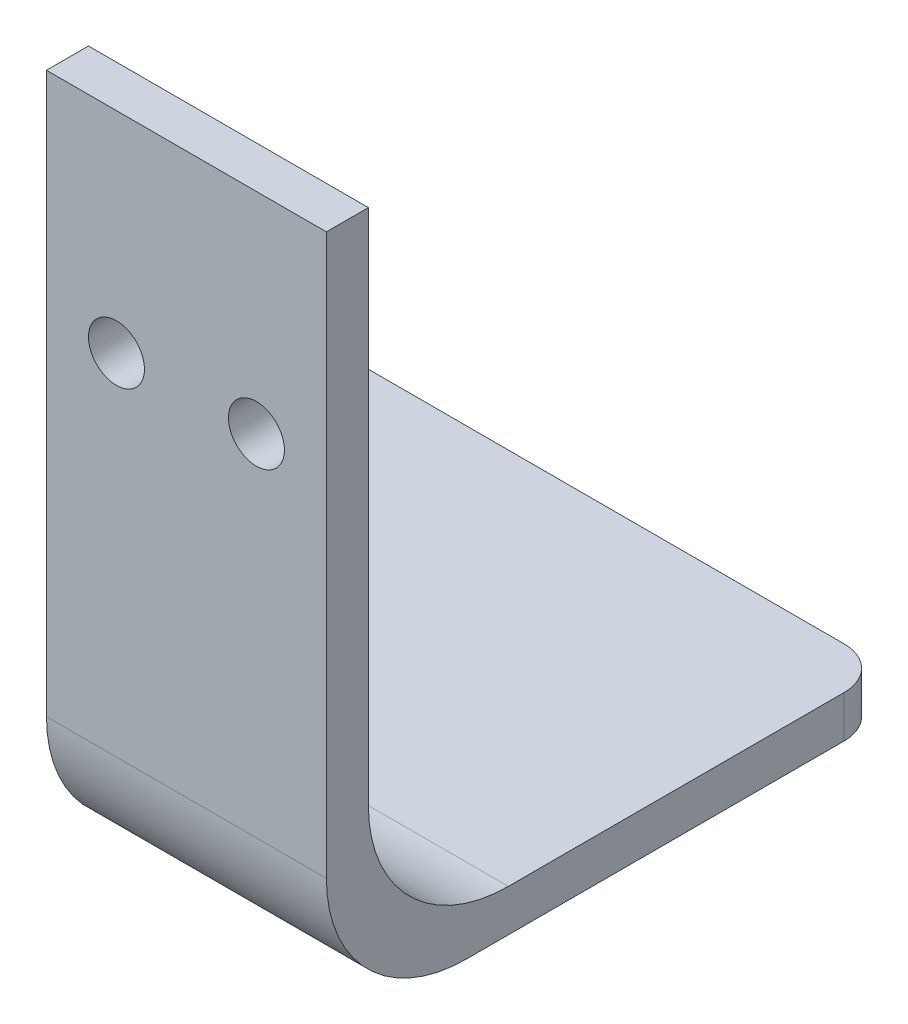
ISO-10303-21;
HEADER;
FILE_DESCRIPTION(('STEP AP214'),'2;1');
FILE_NAME('part.step','',(''),(''),'','','');
FILE_SCHEMA(('AUTOMOTIVE_DESIGN { 1 0 10303 214 1 1 1 1 }'));
ENDSEC;
DATA;
#1=APPLICATION_CONTEXT('core data for automotive mechanical design processes');
#2=APPLICATION_PROTOCOL_DEFINITION('international standard','automotive_design',2000,#1);
#3=PRODUCT_CONTEXT('',#1,'mechanical');
#4=PRODUCT('Part','Part','',(#3));
#5=PRODUCT_RELATED_PRODUCT_CATEGORY('part','',(#4));
#6=PRODUCT_DEFINITION_FORMATION('','',#4);
#7=PRODUCT_DEFINITION_CONTEXT('part definition',#1,'design');
#8=PRODUCT_DEFINITION('design','',#6,#7);
#9=PRODUCT_DEFINITION_SHAPE('','',#8);
#10=(LENGTH_UNIT() NAMED_UNIT(*) SI_UNIT(.MILLI.,.METRE.));
#11=(NAMED_UNIT(*) PLANE_ANGLE_UNIT() SI_UNIT($,.RADIAN.));
#12=(NAMED_UNIT(*) SI_UNIT($,.STERADIAN.) SOLID_ANGLE_UNIT());
#13=UNCERTAINTY_MEASURE_WITH_UNIT(LENGTH_MEASURE(1.E-05),#10,'distance_accuracy_value','');
#14=(GEOMETRIC_REPRESENTATION_CONTEXT(3) GLOBAL_UNCERTAINTY_ASSIGNED_CONTEXT((#13)) GLOBAL_UNIT_ASSIGNED_CONTEXT((#10,
#11,#12)) REPRESENTATION_CONTEXT('',''));
#15=CARTESIAN_POINT('',(0.,0.,0.));
#16=DIRECTION('',(0.,0.,1.));
#17=DIRECTION('',(1.,0.,0.));
#18=AXIS2_PLACEMENT_3D('',#15,#16,#17);
#19=CARTESIAN_POINT('',(0.,0.,-3.));
#20=DIRECTION('',(0.,0.,-1.));
#21=DIRECTION('',(1.,0.,0.));
#22=AXIS2_PLACEMENT_3D('',#19,#20,#21);
#23=PLANE('',#22);
#24=CARTESIAN_POINT('',(-5.,-15.,-3.));
#25=DIRECTION('',(0.,0.,1.));
#26=DIRECTION('',(1.,0.,0.));
#27=AXIS2_PLACEMENT_3D('',#24,#25,#26);
#28=CIRCLE('',#27,2.);
#29=CARTESIAN_POINT('',(-3.,-15.,-3.));
#30=VERTEX_POINT('',#29);
#31=EDGE_CURVE('E172',#30,#30,#28,.T.);
#32=ORIENTED_EDGE('',*,*,#31,.T.);
#33=EDGE_LOOP('',(#32));
#34=FACE_BOUND('',#33,.T.);
#35=CARTESIAN_POINT('',(5.,-15.,-3.));
#36=DIRECTION('',(0.,0.,1.));
#37=DIRECTION('',(1.,0.,0.));
#38=AXIS2_PLACEMENT_3D('',#35,#36,#37);
#39=CIRCLE('',#38,2.);
#40=CARTESIAN_POINT('',(7.,-15.,-3.));
#41=VERTEX_POINT('',#40);
#42=EDGE_CURVE('E258',#41,#41,#39,.T.);
#43=ORIENTED_EDGE('',*,*,#42,.T.);
#44=EDGE_LOOP('',(#43));
#45=FACE_BOUND('',#44,.T.);
#46=DIRECTION('',(0.,-1.,0.));
#47=VECTOR('',#46,1.);
#48=CARTESIAN_POINT('',(-10.,0.,-3.));
#49=LINE('',#48,#47);
#50=CARTESIAN_POINT('',(-10.,0.,-3.));
#51=VERTEX_POINT('',#50);
#52=CARTESIAN_POINT('',(-9.99999999999999,-37.,-3.));
#53=VERTEX_POINT('',#52);
#54=EDGE_CURVE('E161',#51,#53,#49,.T.);
#55=ORIENTED_EDGE('',*,*,#54,.F.);
#56=DIRECTION('',(-1.,0.,0.));
#57=VECTOR('',#56,1.);
#58=CARTESIAN_POINT('',(-10.,0.,-3.));
#59=LINE('',#58,#57);
#60=CARTESIAN_POINT('',(10.,0.,-3.));
#61=VERTEX_POINT('',#60);
#62=EDGE_CURVE('E143',#61,#51,#59,.T.);
#63=ORIENTED_EDGE('',*,*,#62,.F.);
#64=DIRECTION('',(0.,1.,0.));
#65=VECTOR('',#64,1.);
#66=CARTESIAN_POINT('',(10.,0.,-3.));
#67=LINE('',#66,#65);
#68=CARTESIAN_POINT('',(10.,-37.,-3.));
#69=VERTEX_POINT('',#68);
#70=EDGE_CURVE('E153',#69,#61,#67,.T.);
#71=ORIENTED_EDGE('',*,*,#70,.F.);
#72=DIRECTION('',(1.,0.,0.));
#73=VECTOR('',#72,1.);
#74=CARTESIAN_POINT('',(0.,-37.,-3.));
#75=LINE('',#74,#73);
#76=EDGE_CURVE('E187',#53,#69,#75,.T.);
#77=ORIENTED_EDGE('',*,*,#76,.F.);
#78=EDGE_LOOP('',(#55,#63,#71,#77));
#79=FACE_BOUND('',#78,.T.);
#80=ADVANCED_FACE('F37',(#34,#45,#79),#23,.T.);
#81=CARTESIAN_POINT('',(-10.,0.,-3.));
#82=DIRECTION('',(1.,0.,0.));
#83=DIRECTION('',(0.,1.,0.));
#84=AXIS2_PLACEMENT_3D('',#81,#82,#83);
#85=PLANE('',#84);
#86=DIRECTION('',(0.,0.,1.));
#87=VECTOR('',#86,1.);
#88=CARTESIAN_POINT('',(-9.99999999999999,-50.,0.));
#89=LINE('',#88,#87);
#90=CARTESIAN_POINT('',(-9.99999999999998,-50.,-17.));
#91=VERTEX_POINT('',#90);
#92=CARTESIAN_POINT('',(-9.99999999999999,-50.,-10.));
#93=VERTEX_POINT('',#92);
#94=EDGE_CURVE('E241',#91,#93,#89,.T.);
#95=ORIENTED_EDGE('',*,*,#94,.T.);
#96=CARTESIAN_POINT('',(-9.99999999999999,-40.,-10.));
#97=DIRECTION('',(-1.,0.,0.));
#98=DIRECTION('',(0.,1.,0.));
#99=AXIS2_PLACEMENT_3D('',#96,#97,#98);
#100=CIRCLE('',#99,10.);
#101=CARTESIAN_POINT('',(-9.99999999999999,-40.,0.));
#102=VERTEX_POINT('',#101);
#103=EDGE_CURVE('E184',#102,#93,#100,.F.);
#104=ORIENTED_EDGE('',*,*,#103,.F.);
#105=DIRECTION('',(0.,-1.,0.));
#106=VECTOR('',#105,1.);
#107=CARTESIAN_POINT('',(-10.,0.,0.));
#108=LINE('',#107,#106);
#109=CARTESIAN_POINT('',(-10.,0.,0.));
#110=VERTEX_POINT('',#109);
#111=EDGE_CURVE('E168',#110,#102,#108,.T.);
#112=ORIENTED_EDGE('',*,*,#111,.F.);
#113=DIRECTION('',(0.,0.,1.));
#114=VECTOR('',#113,1.);
#115=CARTESIAN_POINT('',(-10.,0.,-3.));
#116=LINE('',#115,#114);
#117=EDGE_CURVE('E150',#51,#110,#116,.T.);
#118=ORIENTED_EDGE('',*,*,#117,.F.);
#119=ORIENTED_EDGE('',*,*,#54,.T.);
#120=CARTESIAN_POINT('',(-9.99999999999999,-37.,-13.));
#121=DIRECTION('',(-1.,0.,0.));
#122=DIRECTION('',(0.,1.,0.));
#123=AXIS2_PLACEMENT_3D('',#120,#121,#122);
#124=CIRCLE('',#123,10.);
#125=CARTESIAN_POINT('',(-9.99999999999999,-47.,-13.));
#126=VERTEX_POINT('',#125);
#127=EDGE_CURVE('E192',#126,#53,#124,.T.);
#128=ORIENTED_EDGE('',*,*,#127,.F.);
#129=DIRECTION('',(0.,0.,1.));
#130=VECTOR('',#129,1.);
#131=CARTESIAN_POINT('',(-9.99999999999999,-47.,0.));
#132=LINE('',#131,#130);
#133=CARTESIAN_POINT('',(-9.99999999999998,-47.,-17.));
#134=VERTEX_POINT('',#133);
#135=EDGE_CURVE('E236',#134,#126,#132,.T.);
#136=ORIENTED_EDGE('',*,*,#135,.F.);
#137=DIRECTION('',(0.,1.,0.));
#138=VECTOR('',#137,1.);
#139=CARTESIAN_POINT('',(-9.99999999999999,-47.,-17.));
#140=LINE('',#139,#138);
#141=EDGE_CURVE('E220',#91,#134,#140,.T.);
#142=ORIENTED_EDGE('',*,*,#141,.F.);
#143=EDGE_LOOP('',(#95,#104,#112,#118,#119,#128,#136,#142));
#144=FACE_BOUND('',#143,.T.);
#145=ADVANCED_FACE('F270',(#144),#85,.F.);
#146=CARTESIAN_POINT('',(0.,0.,0.));
#147=DIRECTION('',(0.,0.,-1.));
#148=DIRECTION('',(1.,0.,0.));
#149=AXIS2_PLACEMENT_3D('',#146,#147,#148);
#150=PLANE('',#149);
#151=DIRECTION('',(0.,1.,0.));
#152=VECTOR('',#151,1.);
#153=CARTESIAN_POINT('',(10.,0.,0.));
#154=LINE('',#153,#152);
#155=CARTESIAN_POINT('',(10.,-40.,0.));
#156=VERTEX_POINT('',#155);
#157=CARTESIAN_POINT('',(10.,0.,0.));
#158=VERTEX_POINT('',#157);
#159=EDGE_CURVE('E171',#156,#158,#154,.T.);
#160=ORIENTED_EDGE('',*,*,#159,.T.);
#161=DIRECTION('',(-1.,0.,0.));
#162=VECTOR('',#161,1.);
#163=CARTESIAN_POINT('',(-10.,0.,0.));
#164=LINE('',#163,#162);
#165=EDGE_CURVE('E145',#158,#110,#164,.T.);
#166=ORIENTED_EDGE('',*,*,#165,.T.);
#167=ORIENTED_EDGE('',*,*,#111,.T.);
#168=DIRECTION('',(1.,0.,0.));
#169=VECTOR('',#168,1.);
#170=CARTESIAN_POINT('',(0.,-40.,0.));
#171=LINE('',#170,#169);
#172=EDGE_CURVE('E182',#156,#102,#171,.F.);
#173=ORIENTED_EDGE('',*,*,#172,.F.);
#174=EDGE_LOOP('',(#160,#166,#167,#173));
#175=FACE_BOUND('',#174,.T.);
#176=CARTESIAN_POINT('',(5.,-15.,0.));
#177=DIRECTION('',(0.,0.,1.));
#178=DIRECTION('',(1.,0.,0.));
#179=AXIS2_PLACEMENT_3D('',#176,#177,#178);
#180=CIRCLE('',#179,2.);
#181=CARTESIAN_POINT('',(7.,-15.,0.));
#182=VERTEX_POINT('',#181);
#183=EDGE_CURVE('E257',#182,#182,#180,.T.);
#184=ORIENTED_EDGE('',*,*,#183,.F.);
#185=EDGE_LOOP('',(#184));
#186=FACE_BOUND('',#185,.T.);
#187=CARTESIAN_POINT('',(-5.,-15.,0.));
#188=DIRECTION('',(0.,0.,1.));
#189=DIRECTION('',(1.,0.,0.));
#190=AXIS2_PLACEMENT_3D('',#187,#188,#189);
#191=CIRCLE('',#190,2.);
#192=CARTESIAN_POINT('',(-3.,-15.,0.));
#193=VERTEX_POINT('',#192);
#194=EDGE_CURVE('E261',#193,#193,#191,.T.);
#195=ORIENTED_EDGE('',*,*,#194,.F.);
#196=EDGE_LOOP('',(#195));
#197=FACE_BOUND('',#196,.T.);
#198=ADVANCED_FACE('F275',(#175,#186,#197),#150,.F.);
#199=CARTESIAN_POINT('',(-9.99999999999999,-50.,-3.));
#200=DIRECTION('',(0.,1.,0.));
#201=DIRECTION('',(-1.,0.,0.));
#202=AXIS2_PLACEMENT_3D('',#199,#200,#201);
#203=PLANE('',#202);
#204=DIRECTION('',(0.,0.,1.));
#205=VECTOR('',#204,1.);
#206=CARTESIAN_POINT('',(-30.,-50.,-40.));
#207=LINE('',#206,#205);
#208=CARTESIAN_POINT('',(-30.,-50.,-37.));
#209=VERTEX_POINT('',#208);
#210=CARTESIAN_POINT('',(-30.,-50.,-23.));
#211=VERTEX_POINT('',#210);
#212=EDGE_CURVE('E254',#209,#211,#207,.T.);
#213=ORIENTED_EDGE('',*,*,#212,.F.);
#214=CARTESIAN_POINT('',(-27.,-50.,-37.));
#215=DIRECTION('',(0.,-1.,0.));
#216=DIRECTION('',(-1.,0.,0.));
#217=AXIS2_PLACEMENT_3D('',#214,#215,#216);
#218=CIRCLE('',#217,3.);
#219=CARTESIAN_POINT('',(-27.,-50.,-40.));
#220=VERTEX_POINT('',#219);
#221=EDGE_CURVE('E211',#220,#209,#218,.F.);
#222=ORIENTED_EDGE('',*,*,#221,.F.);
#223=DIRECTION('',(1.,0.,0.));
#224=VECTOR('',#223,1.);
#225=CARTESIAN_POINT('',(-30.,-50.,-40.));
#226=LINE('',#225,#224);
#227=CARTESIAN_POINT('',(7.00000000000001,-50.,-40.));
#228=VERTEX_POINT('',#227);
#229=EDGE_CURVE('E244',#220,#228,#226,.T.);
#230=ORIENTED_EDGE('',*,*,#229,.T.);
#231=CARTESIAN_POINT('',(7.00000000000001,-50.,-37.));
#232=DIRECTION('',(0.,-1.,0.));
#233=DIRECTION('',(-1.,0.,0.));
#234=AXIS2_PLACEMENT_3D('',#231,#232,#233);
#235=CIRCLE('',#234,3.);
#236=CARTESIAN_POINT('',(10.,-50.,-37.));
#237=VERTEX_POINT('',#236);
#238=EDGE_CURVE('E209',#237,#228,#235,.F.);
#239=ORIENTED_EDGE('',*,*,#238,.F.);
#240=DIRECTION('',(0.,0.,1.));
#241=VECTOR('',#240,1.);
#242=CARTESIAN_POINT('',(10.,-50.,-3.));
#243=LINE('',#242,#241);
#244=CARTESIAN_POINT('',(10.,-50.,-10.));
#245=VERTEX_POINT('',#244);
#246=EDGE_CURVE('E149',#237,#245,#243,.T.);
#247=ORIENTED_EDGE('',*,*,#246,.T.);
#248=DIRECTION('',(1.,0.,0.));
#249=VECTOR('',#248,1.);
#250=CARTESIAN_POINT('',(-9.99999999999999,-50.,-10.));
#251=LINE('',#250,#249);
#252=EDGE_CURVE('E177',#93,#245,#251,.T.);
#253=ORIENTED_EDGE('',*,*,#252,.F.);
#254=ORIENTED_EDGE('',*,*,#94,.F.);
#255=CARTESIAN_POINT('',(-13.,-50.,-17.));
#256=DIRECTION('',(0.,-1.,0.));
#257=DIRECTION('',(-1.,0.,0.));
#258=AXIS2_PLACEMENT_3D('',#255,#256,#257);
#259=CIRCLE('',#258,3.);
#260=CARTESIAN_POINT('',(-13.,-50.,-20.));
#261=VERTEX_POINT('',#260);
#262=EDGE_CURVE('E11',#261,#91,#259,.T.);
#263=ORIENTED_EDGE('',*,*,#262,.F.);
#264=DIRECTION('',(1.,0.,0.));
#265=VECTOR('',#264,1.);
#266=CARTESIAN_POINT('',(-30.,-50.,-20.));
#267=LINE('',#266,#265);
#268=CARTESIAN_POINT('',(-27.,-50.,-20.));
#269=VERTEX_POINT('',#268);
#270=EDGE_CURVE('E238',#269,#261,#267,.T.);
#271=ORIENTED_EDGE('',*,*,#270,.F.);
#272=CARTESIAN_POINT('',(-27.,-50.,-23.));
#273=DIRECTION('',(0.,-1.,0.));
#274=DIRECTION('',(-1.,0.,0.));
#275=AXIS2_PLACEMENT_3D('',#272,#273,#274);
#276=CIRCLE('',#275,3.);
#277=EDGE_CURVE('E213',#211,#269,#276,.F.);
#278=ORIENTED_EDGE('',*,*,#277,.F.);
#279=EDGE_LOOP('',(#213,#222,#230,#239,#247,#253,#254,#263,#271,#278));
#280=FACE_BOUND('',#279,.T.);
#281=ADVANCED_FACE('F285',(#280),#203,.F.);
#282=CARTESIAN_POINT('',(10.,0.,-3.));
#283=DIRECTION('',(-1.,0.,0.));
#284=DIRECTION('',(0.,-1.,0.));
#285=AXIS2_PLACEMENT_3D('',#282,#283,#284);
#286=PLANE('',#285);
#287=DIRECTION('',(0.,0.,1.));
#288=VECTOR('',#287,1.);
#289=CARTESIAN_POINT('',(10.,-47.,-40.));
#290=LINE('',#289,#288);
#291=CARTESIAN_POINT('',(10.,-47.,-37.));
#292=VERTEX_POINT('',#291);
#293=CARTESIAN_POINT('',(10.,-47.,-13.));
#294=VERTEX_POINT('',#293);
#295=EDGE_CURVE('E252',#292,#294,#290,.T.);
#296=ORIENTED_EDGE('',*,*,#295,.T.);
#297=CARTESIAN_POINT('',(10.,-37.,-13.));
#298=DIRECTION('',(1.,0.,0.));
#299=DIRECTION('',(0.,-1.,0.));
#300=AXIS2_PLACEMENT_3D('',#297,#298,#299);
#301=CIRCLE('',#300,10.);
#302=EDGE_CURVE('E157',#69,#294,#301,.T.);
#303=ORIENTED_EDGE('',*,*,#302,.F.);
#304=ORIENTED_EDGE('',*,*,#70,.T.);
#305=DIRECTION('',(0.,0.,1.));
#306=VECTOR('',#305,1.);
#307=CARTESIAN_POINT('',(10.,0.,-3.));
#308=LINE('',#307,#306);
#309=EDGE_CURVE('E138',#61,#158,#308,.T.);
#310=ORIENTED_EDGE('',*,*,#309,.T.);
#311=ORIENTED_EDGE('',*,*,#159,.F.);
#312=CARTESIAN_POINT('',(10.,-40.,-10.));
#313=DIRECTION('',(1.,0.,0.));
#314=DIRECTION('',(0.,-1.,0.));
#315=AXIS2_PLACEMENT_3D('',#312,#313,#314);
#316=CIRCLE('',#315,10.);
#317=EDGE_CURVE('E180',#245,#156,#316,.F.);
#318=ORIENTED_EDGE('',*,*,#317,.F.);
#319=ORIENTED_EDGE('',*,*,#246,.F.);
#320=DIRECTION('',(0.,1.,0.));
#321=VECTOR('',#320,1.);
#322=CARTESIAN_POINT('',(10.,0.,-37.));
#323=LINE('',#322,#321);
#324=EDGE_CURVE('E218',#292,#237,#323,.F.);
#325=ORIENTED_EDGE('',*,*,#324,.F.);
#326=EDGE_LOOP('',(#296,#303,#304,#310,#311,#318,#319,#325));
#327=FACE_BOUND('',#326,.T.);
#328=ADVANCED_FACE('F155',(#327),#286,.F.);
#329=CARTESIAN_POINT('',(-10.,0.,-3.));
#330=DIRECTION('',(0.,-1.,0.));
#331=DIRECTION('',(1.,0.,0.));
#332=AXIS2_PLACEMENT_3D('',#329,#330,#331);
#333=PLANE('',#332);
#334=ORIENTED_EDGE('',*,*,#165,.F.);
#335=ORIENTED_EDGE('',*,*,#309,.F.);
#336=ORIENTED_EDGE('',*,*,#62,.T.);
#337=ORIENTED_EDGE('',*,*,#117,.T.);
#338=EDGE_LOOP('',(#334,#335,#336,#337));
#339=FACE_BOUND('',#338,.T.);
#340=ADVANCED_FACE('F140',(#339),#333,.F.);
#341=CARTESIAN_POINT('',(-5.,-15.,-3.));
#342=DIRECTION('',(0.,0.,1.));
#343=DIRECTION('',(-1.,0.,0.));
#344=AXIS2_PLACEMENT_3D('',#341,#342,#343);
#345=CYLINDRICAL_SURFACE('',#344,2.);
#346=ORIENTED_EDGE('',*,*,#31,.F.);
#347=EDGE_LOOP('',(#346));
#348=FACE_BOUND('',#347,.T.);
#349=ORIENTED_EDGE('',*,*,#194,.T.);
#350=EDGE_LOOP('',(#349));
#351=FACE_BOUND('',#350,.T.);
#352=ADVANCED_FACE('F315',(#348,#351),#345,.F.);
#353=CARTESIAN_POINT('',(5.,-15.,-3.));
#354=DIRECTION('',(0.,0.,1.));
#355=DIRECTION('',(-1.,0.,0.));
#356=AXIS2_PLACEMENT_3D('',#353,#354,#355);
#357=CYLINDRICAL_SURFACE('',#356,2.);
#358=ORIENTED_EDGE('',*,*,#42,.F.);
#359=EDGE_LOOP('',(#358));
#360=FACE_BOUND('',#359,.T.);
#361=ORIENTED_EDGE('',*,*,#183,.T.);
#362=EDGE_LOOP('',(#361));
#363=FACE_BOUND('',#362,.T.);
#364=ADVANCED_FACE('F342',(#360,#363),#357,.F.);
#365=CARTESIAN_POINT('',(-30.,-50.,-40.));
#366=DIRECTION('',(1.,0.,0.));
#367=DIRECTION('',(0.,0.,1.));
#368=AXIS2_PLACEMENT_3D('',#365,#366,#367);
#369=PLANE('',#368);
#370=DIRECTION('',(0.,0.,1.));
#371=VECTOR('',#370,1.);
#372=CARTESIAN_POINT('',(-30.,-47.,-40.));
#373=LINE('',#372,#371);
#374=CARTESIAN_POINT('',(-30.,-47.,-37.));
#375=VERTEX_POINT('',#374);
#376=CARTESIAN_POINT('',(-30.,-47.,-23.));
#377=VERTEX_POINT('',#376);
#378=EDGE_CURVE('E250',#375,#377,#373,.T.);
#379=ORIENTED_EDGE('',*,*,#378,.F.);
#380=DIRECTION('',(0.,-1.,0.));
#381=VECTOR('',#380,1.);
#382=CARTESIAN_POINT('',(-30.,-50.,-37.));
#383=LINE('',#382,#381);
#384=EDGE_CURVE('E204',#209,#375,#383,.F.);
#385=ORIENTED_EDGE('',*,*,#384,.F.);
#386=ORIENTED_EDGE('',*,*,#212,.T.);
#387=DIRECTION('',(0.,1.,0.));
#388=VECTOR('',#387,1.);
#389=CARTESIAN_POINT('',(-30.,-50.,-23.));
#390=LINE('',#389,#388);
#391=EDGE_CURVE('E207',#377,#211,#390,.F.);
#392=ORIENTED_EDGE('',*,*,#391,.F.);
#393=EDGE_LOOP('',(#379,#385,#386,#392));
#394=FACE_BOUND('',#393,.T.);
#395=ADVANCED_FACE('F349',(#394),#369,.F.);
#396=CARTESIAN_POINT('',(-30.,-47.,-40.));
#397=DIRECTION('',(0.,-1.,0.));
#398=DIRECTION('',(0.,0.,1.));
#399=AXIS2_PLACEMENT_3D('',#396,#397,#398);
#400=PLANE('',#399);
#401=DIRECTION('',(1.,0.,0.));
#402=VECTOR('',#401,1.);
#403=CARTESIAN_POINT('',(-30.,-47.,-20.));
#404=LINE('',#403,#402);
#405=CARTESIAN_POINT('',(-27.,-47.,-20.));
#406=VERTEX_POINT('',#405);
#407=CARTESIAN_POINT('',(-13.,-47.,-20.));
#408=VERTEX_POINT('',#407);
#409=EDGE_CURVE('E232',#406,#408,#404,.T.);
#410=ORIENTED_EDGE('',*,*,#409,.T.);
#411=CARTESIAN_POINT('',(-13.,-47.,-17.));
#412=DIRECTION('',(0.,1.,0.));
#413=DIRECTION('',(0.,0.,1.));
#414=AXIS2_PLACEMENT_3D('',#411,#412,#413);
#415=CIRCLE('',#414,3.);
#416=EDGE_CURVE('E45',#134,#408,#415,.T.);
#417=ORIENTED_EDGE('',*,*,#416,.F.);
#418=ORIENTED_EDGE('',*,*,#135,.T.);
#419=DIRECTION('',(1.,0.,0.));
#420=VECTOR('',#419,1.);
#421=CARTESIAN_POINT('',(-30.,-47.,-13.));
#422=LINE('',#421,#420);
#423=EDGE_CURVE('E189',#294,#126,#422,.F.);
#424=ORIENTED_EDGE('',*,*,#423,.F.);
#425=ORIENTED_EDGE('',*,*,#295,.F.);
#426=CARTESIAN_POINT('',(7.00000000000001,-47.,-37.));
#427=DIRECTION('',(0.,1.,0.));
#428=DIRECTION('',(0.,0.,1.));
#429=AXIS2_PLACEMENT_3D('',#426,#427,#428);
#430=CIRCLE('',#429,3.);
#431=CARTESIAN_POINT('',(7.00000000000001,-47.,-40.));
#432=VERTEX_POINT('',#431);
#433=EDGE_CURVE('E198',#432,#292,#430,.F.);
#434=ORIENTED_EDGE('',*,*,#433,.F.);
#435=DIRECTION('',(-1.,0.,0.));
#436=VECTOR('',#435,1.);
#437=CARTESIAN_POINT('',(-30.,-47.,-40.));
#438=LINE('',#437,#436);
#439=CARTESIAN_POINT('',(-27.,-47.,-40.));
#440=VERTEX_POINT('',#439);
#441=EDGE_CURVE('E247',#432,#440,#438,.T.);
#442=ORIENTED_EDGE('',*,*,#441,.T.);
#443=CARTESIAN_POINT('',(-27.,-47.,-37.));
#444=DIRECTION('',(0.,1.,0.));
#445=DIRECTION('',(0.,0.,1.));
#446=AXIS2_PLACEMENT_3D('',#443,#444,#445);
#447=CIRCLE('',#446,3.);
#448=EDGE_CURVE('E200',#375,#440,#447,.F.);
#449=ORIENTED_EDGE('',*,*,#448,.F.);
#450=ORIENTED_EDGE('',*,*,#378,.T.);
#451=CARTESIAN_POINT('',(-27.,-47.,-23.));
#452=DIRECTION('',(0.,1.,0.));
#453=DIRECTION('',(0.,0.,1.));
#454=AXIS2_PLACEMENT_3D('',#451,#452,#453);
#455=CIRCLE('',#454,3.);
#456=EDGE_CURVE('E202',#406,#377,#455,.F.);
#457=ORIENTED_EDGE('',*,*,#456,.F.);
#458=EDGE_LOOP('',(#410,#417,#418,#424,#425,#434,#442,#449,#450,#457));
#459=FACE_BOUND('',#458,.T.);
#460=ADVANCED_FACE('F233',(#459),#400,.F.);
#461=CARTESIAN_POINT('',(0.,0.,-40.));
#462=DIRECTION('',(0.,0.,1.));
#463=DIRECTION('',(-1.,0.,0.));
#464=AXIS2_PLACEMENT_3D('',#461,#462,#463);
#465=PLANE('',#464);
#466=ORIENTED_EDGE('',*,*,#441,.F.);
#467=DIRECTION('',(0.,1.,0.));
#468=VECTOR('',#467,1.);
#469=CARTESIAN_POINT('',(7.,0.,-40.));
#470=LINE('',#469,#468);
#471=EDGE_CURVE('E52',#228,#432,#470,.T.);
#472=ORIENTED_EDGE('',*,*,#471,.F.);
#473=ORIENTED_EDGE('',*,*,#229,.F.);
#474=DIRECTION('',(0.,-1.,0.));
#475=VECTOR('',#474,1.);
#476=CARTESIAN_POINT('',(-27.,0.,-40.));
#477=LINE('',#476,#475);
#478=EDGE_CURVE('E60',#440,#220,#477,.T.);
#479=ORIENTED_EDGE('',*,*,#478,.F.);
#480=EDGE_LOOP('',(#466,#472,#473,#479));
#481=FACE_BOUND('',#480,.T.);
#482=ADVANCED_FACE('F363',(#481),#465,.F.);
#483=CARTESIAN_POINT('',(-30.,-50.,-20.));
#484=DIRECTION('',(0.,0.,-1.));
#485=DIRECTION('',(1.,0.,0.));
#486=AXIS2_PLACEMENT_3D('',#483,#484,#485);
#487=PLANE('',#486);
#488=ORIENTED_EDGE('',*,*,#270,.T.);
#489=DIRECTION('',(0.,1.,0.));
#490=VECTOR('',#489,1.);
#491=CARTESIAN_POINT('',(-13.,-50.,-20.));
#492=LINE('',#491,#490);
#493=EDGE_CURVE('E194',#408,#261,#492,.F.);
#494=ORIENTED_EDGE('',*,*,#493,.F.);
#495=ORIENTED_EDGE('',*,*,#409,.F.);
#496=DIRECTION('',(0.,1.,0.));
#497=VECTOR('',#496,1.);
#498=CARTESIAN_POINT('',(-27.,-50.,-20.));
#499=LINE('',#498,#497);
#500=EDGE_CURVE('E196',#269,#406,#499,.T.);
#501=ORIENTED_EDGE('',*,*,#500,.F.);
#502=EDGE_LOOP('',(#488,#494,#495,#501));
#503=FACE_BOUND('',#502,.T.);
#504=ADVANCED_FACE('F303',(#503),#487,.F.);
#505=CARTESIAN_POINT('',(-9.99999999999999,-40.,-10.));
#506=DIRECTION('',(1.,0.,0.));
#507=DIRECTION('',(0.,1.,0.));
#508=AXIS2_PLACEMENT_3D('',#505,#506,#507);
#509=CYLINDRICAL_SURFACE('',#508,10.);
#510=ORIENTED_EDGE('',*,*,#103,.T.);
#511=ORIENTED_EDGE('',*,*,#252,.T.);
#512=ORIENTED_EDGE('',*,*,#317,.T.);
#513=ORIENTED_EDGE('',*,*,#172,.T.);
#514=EDGE_LOOP('',(#510,#511,#512,#513));
#515=FACE_BOUND('',#514,.T.);
#516=ADVANCED_FACE('F281',(#515),#509,.T.);
#517=CARTESIAN_POINT('',(0.,-37.,-13.));
#518=DIRECTION('',(1.,0.,0.));
#519=DIRECTION('',(0.,0.,1.));
#520=AXIS2_PLACEMENT_3D('',#517,#518,#519);
#521=CYLINDRICAL_SURFACE('',#520,10.);
#522=ORIENTED_EDGE('',*,*,#127,.T.);
#523=ORIENTED_EDGE('',*,*,#76,.T.);
#524=ORIENTED_EDGE('',*,*,#302,.T.);
#525=ORIENTED_EDGE('',*,*,#423,.T.);
#526=EDGE_LOOP('',(#522,#523,#524,#525));
#527=FACE_BOUND('',#526,.T.);
#528=ADVANCED_FACE('F292',(#527),#521,.F.);
#529=CARTESIAN_POINT('',(-27.,-50.,-23.));
#530=DIRECTION('',(0.,1.,0.));
#531=DIRECTION('',(0.,0.,-1.));
#532=AXIS2_PLACEMENT_3D('',#529,#530,#531);
#533=CYLINDRICAL_SURFACE('',#532,3.);
#534=ORIENTED_EDGE('',*,*,#277,.T.);
#535=ORIENTED_EDGE('',*,*,#500,.T.);
#536=ORIENTED_EDGE('',*,*,#456,.T.);
#537=ORIENTED_EDGE('',*,*,#391,.T.);
#538=EDGE_LOOP('',(#534,#535,#536,#537));
#539=FACE_BOUND('',#538,.T.);
#540=ADVANCED_FACE('F294',(#539),#533,.T.);
#541=CARTESIAN_POINT('',(-27.,0.,-37.));
#542=DIRECTION('',(0.,-1.,0.));
#543=DIRECTION('',(0.,0.,1.));
#544=AXIS2_PLACEMENT_3D('',#541,#542,#543);
#545=CYLINDRICAL_SURFACE('',#544,3.);
#546=ORIENTED_EDGE('',*,*,#448,.T.);
#547=ORIENTED_EDGE('',*,*,#478,.T.);
#548=ORIENTED_EDGE('',*,*,#221,.T.);
#549=ORIENTED_EDGE('',*,*,#384,.T.);
#550=EDGE_LOOP('',(#546,#547,#548,#549));
#551=FACE_BOUND('',#550,.T.);
#552=ADVANCED_FACE('F300',(#551),#545,.T.);
#553=CARTESIAN_POINT('',(7.,0.,-37.));
#554=DIRECTION('',(0.,1.,0.));
#555=DIRECTION('',(-1.,0.,0.));
#556=AXIS2_PLACEMENT_3D('',#553,#554,#555);
#557=CYLINDRICAL_SURFACE('',#556,3.);
#558=ORIENTED_EDGE('',*,*,#238,.T.);
#559=ORIENTED_EDGE('',*,*,#471,.T.);
#560=ORIENTED_EDGE('',*,*,#433,.T.);
#561=ORIENTED_EDGE('',*,*,#324,.T.);
#562=EDGE_LOOP('',(#558,#559,#560,#561));
#563=FACE_BOUND('',#562,.T.);
#564=ADVANCED_FACE('F288',(#563),#557,.T.);
#565=CARTESIAN_POINT('',(-13.,0.,-17.));
#566=DIRECTION('',(0.,-1.,0.));
#567=DIRECTION('',(1.,0.,0.));
#568=AXIS2_PLACEMENT_3D('',#565,#566,#567);
#569=CYLINDRICAL_SURFACE('',#568,3.);
#570=ORIENTED_EDGE('',*,*,#262,.T.);
#571=ORIENTED_EDGE('',*,*,#141,.T.);
#572=ORIENTED_EDGE('',*,*,#416,.T.);
#573=ORIENTED_EDGE('',*,*,#493,.T.);
#574=EDGE_LOOP('',(#570,#571,#572,#573));
#575=FACE_BOUND('',#574,.T.);
#576=ADVANCED_FACE('F39',(#575),#569,.F.);
#577=CLOSED_SHELL('',(#80,#145,#198,#281,#328,#340,#352,#364,#395,#460,#482,#504,#516,#528,#540,
#552,#564,#576));
#578=MANIFOLD_SOLID_BREP('B2',#577);
#579=ADVANCED_BREP_SHAPE_REPRESENTATION('',(#18,#578),#14);
#580=SHAPE_DEFINITION_REPRESENTATION(#9,#579);
ENDSEC;
END-ISO-10303-21;
